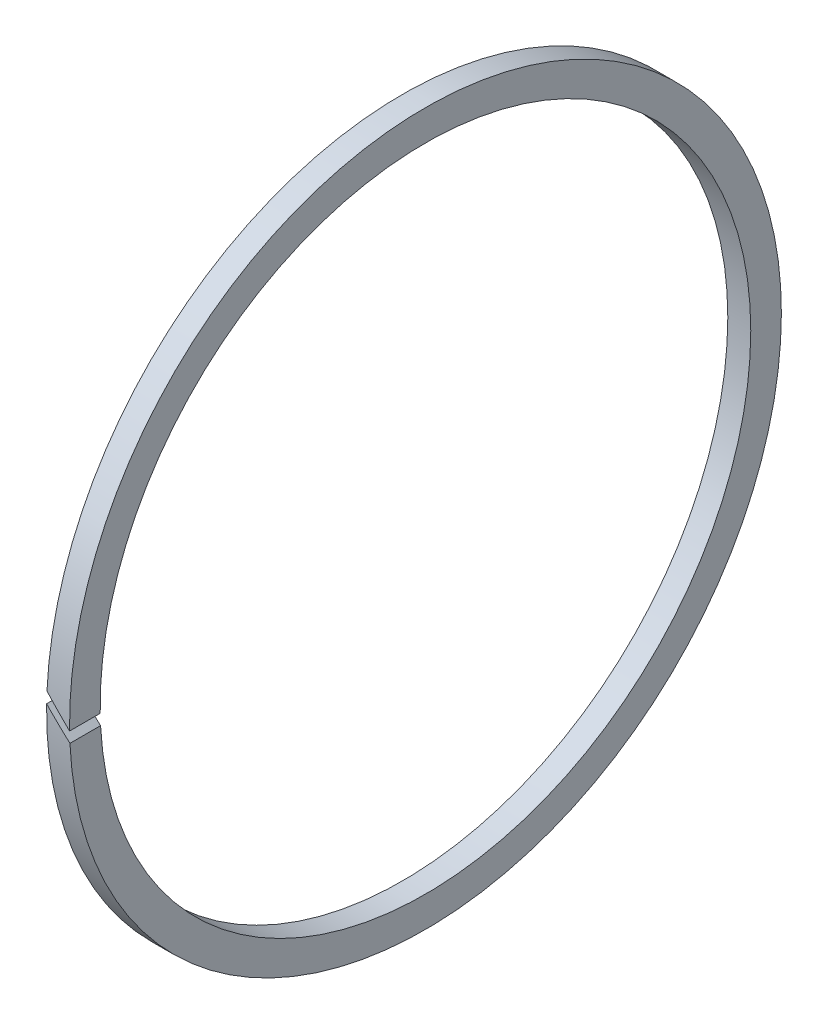
ISO-10303-21;
HEADER;
FILE_DESCRIPTION(('STEP AP214'),'2;1');
FILE_NAME('part.step','',(''),(''),'','','');
FILE_SCHEMA(('AUTOMOTIVE_DESIGN { 1 0 10303 214 1 1 1 1 }'));
ENDSEC;
DATA;
#1=APPLICATION_CONTEXT('core data for automotive mechanical design processes');
#2=APPLICATION_PROTOCOL_DEFINITION('international standard','automotive_design',2000,#1);
#3=PRODUCT_CONTEXT('',#1,'mechanical');
#4=PRODUCT('Part','Part','',(#3));
#5=PRODUCT_RELATED_PRODUCT_CATEGORY('part','',(#4));
#6=PRODUCT_DEFINITION_FORMATION('','',#4);
#7=PRODUCT_DEFINITION_CONTEXT('part definition',#1,'design');
#8=PRODUCT_DEFINITION('design','',#6,#7);
#9=PRODUCT_DEFINITION_SHAPE('','',#8);
#10=(LENGTH_UNIT() NAMED_UNIT(*) SI_UNIT(.MILLI.,.METRE.));
#11=(NAMED_UNIT(*) PLANE_ANGLE_UNIT() SI_UNIT($,.RADIAN.));
#12=(NAMED_UNIT(*) SI_UNIT($,.STERADIAN.) SOLID_ANGLE_UNIT());
#13=UNCERTAINTY_MEASURE_WITH_UNIT(LENGTH_MEASURE(1.E-05),#10,'distance_accuracy_value','');
#14=(GEOMETRIC_REPRESENTATION_CONTEXT(3) GLOBAL_UNCERTAINTY_ASSIGNED_CONTEXT((#13)) GLOBAL_UNIT_ASSIGNED_CONTEXT((#10,
#11,#12)) REPRESENTATION_CONTEXT('',''));
#15=CARTESIAN_POINT('',(0.,0.,0.));
#16=DIRECTION('',(0.,0.,1.));
#17=DIRECTION('',(1.,0.,0.));
#18=AXIS2_PLACEMENT_3D('',#15,#16,#17);
#19=CARTESIAN_POINT('',(0.,42.5,0.));
#20=DIRECTION('',(1.,0.,0.));
#21=DIRECTION('',(0.,0.,-1.));
#22=AXIS2_PLACEMENT_3D('',#19,#20,#21);
#23=PLANE('',#22);
#24=DIRECTION('',(0.,0.,1.));
#25=VECTOR('',#24,1.);
#26=CARTESIAN_POINT('',(0.,2.20710678118656,46.501));
#27=LINE('',#26,#25);
#28=CARTESIAN_POINT('',(0.,2.20710678118656,42.4426516567526));
#29=VERTEX_POINT('',#28);
#30=CARTESIAN_POINT('',(0.,2.20710678118656,46.4475906765511));
#31=VERTEX_POINT('',#30);
#32=EDGE_CURVE('E59',#29,#31,#27,.T.);
#33=ORIENTED_EDGE('',*,*,#32,.T.);
#34=CARTESIAN_POINT('',(0.,0.,0.));
#35=DIRECTION('',(-1.,0.,0.));
#36=DIRECTION('',(0.,0.,1.));
#37=AXIS2_PLACEMENT_3D('',#34,#35,#36);
#38=CIRCLE('',#37,46.5);
#39=CARTESIAN_POINT('',(0.,0.792893218813457,46.4932395122512));
#40=VERTEX_POINT('',#39);
#41=EDGE_CURVE('E11',#31,#40,#38,.T.);
#42=ORIENTED_EDGE('',*,*,#41,.T.);
#43=DIRECTION('',(0.,0.,-1.));
#44=VECTOR('',#43,1.);
#45=CARTESIAN_POINT('',(0.,0.792893218813457,46.501));
#46=LINE('',#45,#44);
#47=CARTESIAN_POINT('',(0.,0.792893218813457,42.4926031250565));
#48=VERTEX_POINT('',#47);
#49=EDGE_CURVE('E91',#40,#48,#46,.T.);
#50=ORIENTED_EDGE('',*,*,#49,.T.);
#51=CARTESIAN_POINT('',(0.,0.,0.));
#52=DIRECTION('',(-1.,0.,0.));
#53=DIRECTION('',(0.,0.,1.));
#54=AXIS2_PLACEMENT_3D('',#51,#52,#53);
#55=CIRCLE('',#54,42.5);
#56=EDGE_CURVE('E103',#29,#48,#55,.T.);
#57=ORIENTED_EDGE('',*,*,#56,.F.);
#58=EDGE_LOOP('',(#33,#42,#50,#57));
#59=FACE_BOUND('',#58,.T.);
#60=ADVANCED_FACE('F45',(#59),#23,.F.);
#61=CARTESIAN_POINT('',(0.,0.,0.));
#62=DIRECTION('',(-1.,0.,0.));
#63=DIRECTION('',(0.,0.,1.));
#64=AXIS2_PLACEMENT_3D('',#61,#62,#63);
#65=CYLINDRICAL_SURFACE('',#64,46.5);
#66=CARTESIAN_POINT('',(2.20710678118655,0.,0.));
#67=DIRECTION('',(-0.707106781186549,-0.707106781186546,0.));
#68=DIRECTION('',(-0.707106781186546,0.707106781186549,0.));
#69=AXIS2_PLACEMENT_3D('',#66,#67,#68);
#70=ELLIPSE('',#69,65.7609306503488,46.5);
#71=CARTESIAN_POINT('',(3.,-0.792893218813455,46.4932395122512));
#72=VERTEX_POINT('',#71);
#73=EDGE_CURVE('E99',#31,#72,#70,.F.);
#74=ORIENTED_EDGE('',*,*,#73,.T.);
#75=CARTESIAN_POINT('',(3.,0.,0.));
#76=DIRECTION('',(-1.,0.,0.));
#77=DIRECTION('',(0.,0.,1.));
#78=AXIS2_PLACEMENT_3D('',#75,#76,#77);
#79=CIRCLE('',#78,46.5);
#80=CARTESIAN_POINT('',(3.,-2.20710678118655,46.4475906765511));
#81=VERTEX_POINT('',#80);
#82=EDGE_CURVE('E52',#72,#81,#79,.T.);
#83=ORIENTED_EDGE('',*,*,#82,.T.);
#84=CARTESIAN_POINT('',(0.792893218813454,0.,0.));
#85=DIRECTION('',(0.707106781186549,0.707106781186546,0.));
#86=DIRECTION('',(-0.707106781186546,0.707106781186549,0.));
#87=AXIS2_PLACEMENT_3D('',#84,#85,#86);
#88=ELLIPSE('',#87,65.7609306503488,46.5);
#89=EDGE_CURVE('E111',#81,#40,#88,.F.);
#90=ORIENTED_EDGE('',*,*,#89,.T.);
#91=ORIENTED_EDGE('',*,*,#41,.F.);
#92=EDGE_LOOP('',(#74,#83,#90,#91));
#93=FACE_BOUND('',#92,.T.);
#94=ADVANCED_FACE('F116',(#93),#65,.T.);
#95=CARTESIAN_POINT('',(3.,46.5,0.));
#96=DIRECTION('',(-1.,0.,0.));
#97=DIRECTION('',(0.,0.,1.));
#98=AXIS2_PLACEMENT_3D('',#95,#96,#97);
#99=PLANE('',#98);
#100=DIRECTION('',(0.,0.,-1.));
#101=VECTOR('',#100,1.);
#102=CARTESIAN_POINT('',(3.,-0.792893218813455,46.501));
#103=LINE('',#102,#101);
#104=CARTESIAN_POINT('',(3.,-0.792893218813453,42.4926031250565));
#105=VERTEX_POINT('',#104);
#106=EDGE_CURVE('E85',#72,#105,#103,.T.);
#107=ORIENTED_EDGE('',*,*,#106,.T.);
#108=CARTESIAN_POINT('',(3.,0.,0.));
#109=DIRECTION('',(-1.,0.,0.));
#110=DIRECTION('',(0.,0.,1.));
#111=AXIS2_PLACEMENT_3D('',#108,#109,#110);
#112=CIRCLE('',#111,42.5);
#113=CARTESIAN_POINT('',(3.,-2.20710678118655,42.4426516567526));
#114=VERTEX_POINT('',#113);
#115=EDGE_CURVE('E97',#105,#114,#112,.T.);
#116=ORIENTED_EDGE('',*,*,#115,.T.);
#117=DIRECTION('',(0.,0.,1.));
#118=VECTOR('',#117,1.);
#119=CARTESIAN_POINT('',(3.,-2.20710678118655,46.501));
#120=LINE('',#119,#118);
#121=EDGE_CURVE('E67',#114,#81,#120,.T.);
#122=ORIENTED_EDGE('',*,*,#121,.T.);
#123=ORIENTED_EDGE('',*,*,#82,.F.);
#124=EDGE_LOOP('',(#107,#116,#122,#123));
#125=FACE_BOUND('',#124,.T.);
#126=ADVANCED_FACE('F96',(#125),#99,.F.);
#127=CARTESIAN_POINT('',(0.,0.,0.));
#128=DIRECTION('',(-1.,0.,0.));
#129=DIRECTION('',(0.,0.,1.));
#130=AXIS2_PLACEMENT_3D('',#127,#128,#129);
#131=CYLINDRICAL_SURFACE('',#130,42.5);
#132=CARTESIAN_POINT('',(2.20710678118655,0.,0.));
#133=DIRECTION('',(-0.707106781186549,-0.707106781186546,0.));
#134=DIRECTION('',(-0.707106781186546,0.707106781186549,0.));
#135=AXIS2_PLACEMENT_3D('',#132,#133,#134);
#136=ELLIPSE('',#135,60.1040764008564,42.5);
#137=EDGE_CURVE('E82',#105,#29,#136,.T.);
#138=ORIENTED_EDGE('',*,*,#137,.T.);
#139=ORIENTED_EDGE('',*,*,#56,.T.);
#140=CARTESIAN_POINT('',(0.792893218813454,0.,0.));
#141=DIRECTION('',(0.707106781186549,0.707106781186546,0.));
#142=DIRECTION('',(-0.707106781186546,0.707106781186549,0.));
#143=AXIS2_PLACEMENT_3D('',#140,#141,#142);
#144=ELLIPSE('',#143,60.1040764008564,42.5);
#145=EDGE_CURVE('E102',#48,#114,#144,.T.);
#146=ORIENTED_EDGE('',*,*,#145,.T.);
#147=ORIENTED_EDGE('',*,*,#115,.F.);
#148=EDGE_LOOP('',(#138,#139,#146,#147));
#149=FACE_BOUND('',#148,.T.);
#150=ADVANCED_FACE('F101',(#149),#131,.F.);
#151=CARTESIAN_POINT('',(-1.69317097524024,2.48606419405371,46.501));
#152=DIRECTION('',(0.707106781186549,0.707106781186546,0.));
#153=DIRECTION('',(-0.707106781186546,0.707106781186549,0.));
#154=AXIS2_PLACEMENT_3D('',#151,#152,#153);
#155=PLANE('',#154);
#156=ORIENTED_EDGE('',*,*,#89,.F.);
#157=ORIENTED_EDGE('',*,*,#121,.F.);
#158=ORIENTED_EDGE('',*,*,#145,.F.);
#159=ORIENTED_EDGE('',*,*,#49,.F.);
#160=EDGE_LOOP('',(#156,#157,#158,#159));
#161=FACE_BOUND('',#160,.T.);
#162=ADVANCED_FACE('F119',(#161),#155,.T.);
#163=CARTESIAN_POINT('',(-0.986064194053694,3.19317097524025,46.501));
#164=DIRECTION('',(-0.707106781186549,-0.707106781186546,0.));
#165=DIRECTION('',(0.707106781186546,-0.707106781186549,0.));
#166=AXIS2_PLACEMENT_3D('',#163,#164,#165);
#167=PLANE('',#166);
#168=ORIENTED_EDGE('',*,*,#137,.F.);
#169=ORIENTED_EDGE('',*,*,#106,.F.);
#170=ORIENTED_EDGE('',*,*,#73,.F.);
#171=ORIENTED_EDGE('',*,*,#32,.F.);
#172=EDGE_LOOP('',(#168,#169,#170,#171));
#173=FACE_BOUND('',#172,.T.);
#174=ADVANCED_FACE('F84',(#173),#167,.T.);
#175=CLOSED_SHELL('',(#60,#94,#126,#150,#162,#174));
#176=MANIFOLD_SOLID_BREP('B2',#175);
#177=ADVANCED_BREP_SHAPE_REPRESENTATION('',(#18,#176),#14);
#178=SHAPE_DEFINITION_REPRESENTATION(#9,#177);
ENDSEC;
END-ISO-10303-21;
